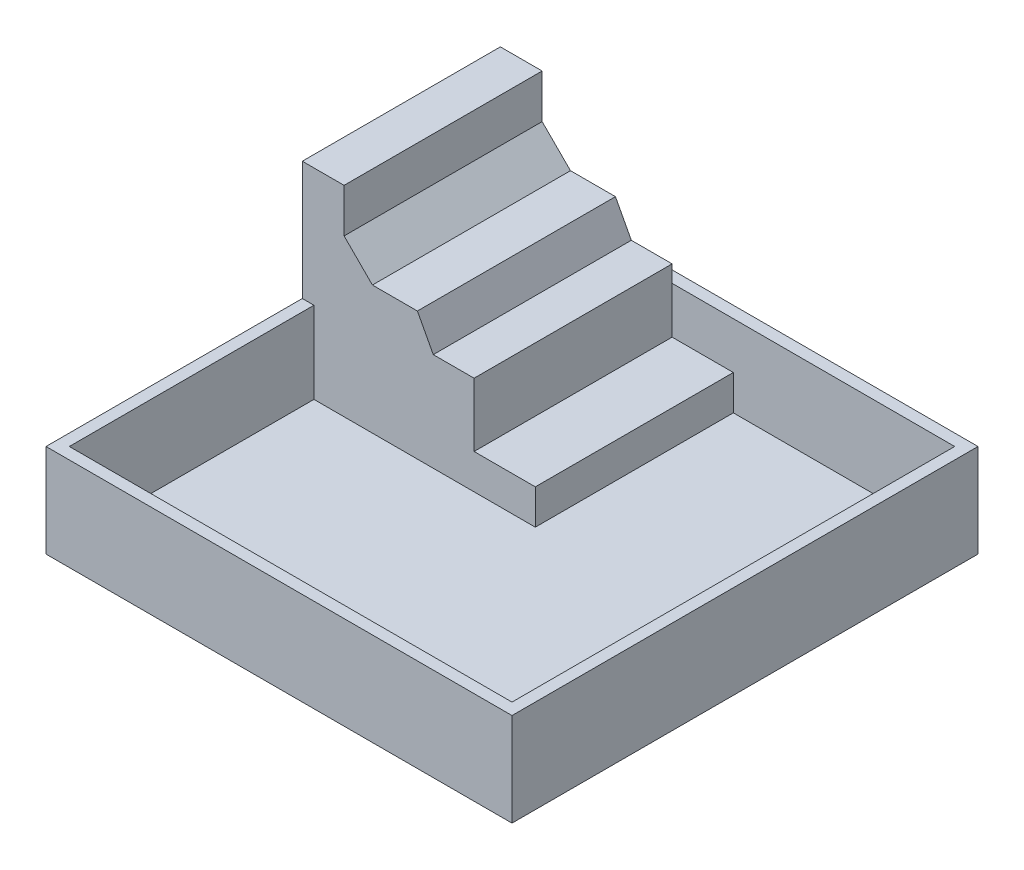
ISO-10303-21;
HEADER;
FILE_DESCRIPTION(('STEP AP214'),'2;1');
FILE_NAME('part.step','',(''),(''),'','','');
FILE_SCHEMA(('AUTOMOTIVE_DESIGN { 1 0 10303 214 1 1 1 1 }'));
ENDSEC;
DATA;
#1=APPLICATION_CONTEXT('core data for automotive mechanical design processes');
#2=APPLICATION_PROTOCOL_DEFINITION('international standard','automotive_design',2000,#1);
#3=PRODUCT_CONTEXT('',#1,'mechanical');
#4=PRODUCT('Part','Part','',(#3));
#5=PRODUCT_RELATED_PRODUCT_CATEGORY('part','',(#4));
#6=PRODUCT_DEFINITION_FORMATION('','',#4);
#7=PRODUCT_DEFINITION_CONTEXT('part definition',#1,'design');
#8=PRODUCT_DEFINITION('design','',#6,#7);
#9=PRODUCT_DEFINITION_SHAPE('','',#8);
#10=(LENGTH_UNIT() NAMED_UNIT(*) SI_UNIT(.MILLI.,.METRE.));
#11=(NAMED_UNIT(*) PLANE_ANGLE_UNIT() SI_UNIT($,.RADIAN.));
#12=(NAMED_UNIT(*) SI_UNIT($,.STERADIAN.) SOLID_ANGLE_UNIT());
#13=UNCERTAINTY_MEASURE_WITH_UNIT(LENGTH_MEASURE(1.E-05),#10,'distance_accuracy_value','');
#14=(GEOMETRIC_REPRESENTATION_CONTEXT(3) GLOBAL_UNCERTAINTY_ASSIGNED_CONTEXT((#13)) GLOBAL_UNIT_ASSIGNED_CONTEXT((#10,
#11,#12)) REPRESENTATION_CONTEXT('',''));
#15=CARTESIAN_POINT('',(0.,0.,0.));
#16=DIRECTION('',(0.,0.,1.));
#17=DIRECTION('',(1.,0.,0.));
#18=AXIS2_PLACEMENT_3D('',#15,#16,#17);
#19=CARTESIAN_POINT('',(0.,91.03608723386,-110.));
#20=DIRECTION('',(0.,-1.,0.));
#21=DIRECTION('',(0.,0.,-1.));
#22=AXIS2_PLACEMENT_3D('',#19,#20,#21);
#23=PLANE('',#22);
#24=DIRECTION('',(-1.,0.,0.));
#25=VECTOR('',#24,1.);
#26=CARTESIAN_POINT('',(0.,91.03608723386,-195.));
#27=LINE('',#26,#25);
#28=CARTESIAN_POINT('',(17.9354791316587,91.03608723386,-195.));
#29=VERTEX_POINT('',#28);
#30=CARTESIAN_POINT('',(0.,91.03608723386,-195.));
#31=VERTEX_POINT('',#30);
#32=EDGE_CURVE('E327',#29,#31,#27,.T.);
#33=ORIENTED_EDGE('',*,*,#32,.T.);
#34=DIRECTION('',(0.,0.,-1.));
#35=VECTOR('',#34,1.);
#36=CARTESIAN_POINT('',(0.,91.03608723386,-110.));
#37=LINE('',#36,#35);
#38=CARTESIAN_POINT('',(0.,91.03608723386,-110.));
#39=VERTEX_POINT('',#38);
#40=EDGE_CURVE('E213',#39,#31,#37,.T.);
#41=ORIENTED_EDGE('',*,*,#40,.F.);
#42=DIRECTION('',(-1.,0.,0.));
#43=VECTOR('',#42,1.);
#44=CARTESIAN_POINT('',(0.,91.03608723386,-110.));
#45=LINE('',#44,#43);
#46=CARTESIAN_POINT('',(17.9354791316587,91.03608723386,-110.));
#47=VERTEX_POINT('',#46);
#48=EDGE_CURVE('E208',#47,#39,#45,.T.);
#49=ORIENTED_EDGE('',*,*,#48,.F.);
#50=DIRECTION('',(0.,0.,-1.));
#51=VECTOR('',#50,1.);
#52=CARTESIAN_POINT('',(17.9354791316587,91.03608723386,-110.));
#53=LINE('',#52,#51);
#54=EDGE_CURVE('E11',#47,#29,#53,.T.);
#55=ORIENTED_EDGE('',*,*,#54,.T.);
#56=EDGE_LOOP('',(#33,#41,#49,#55));
#57=FACE_BOUND('',#56,.T.);
#58=ADVANCED_FACE('F17',(#57),#23,.F.);
#59=CARTESIAN_POINT('',(17.9354791316587,91.03608723386,-110.));
#60=DIRECTION('',(-1.,0.,0.));
#61=DIRECTION('',(0.,0.,1.));
#62=AXIS2_PLACEMENT_3D('',#59,#60,#61);
#63=PLANE('',#62);
#64=DIRECTION('',(0.,1.,0.));
#65=VECTOR('',#64,1.);
#66=CARTESIAN_POINT('',(17.9354791316587,91.03608723386,-195.));
#67=LINE('',#66,#65);
#68=CARTESIAN_POINT('',(17.9354791316587,72.2228769162165,-195.));
#69=VERTEX_POINT('',#68);
#70=EDGE_CURVE('E272',#69,#29,#67,.T.);
#71=ORIENTED_EDGE('',*,*,#70,.T.);
#72=ORIENTED_EDGE('',*,*,#54,.F.);
#73=DIRECTION('',(0.,1.,0.));
#74=VECTOR('',#73,1.);
#75=CARTESIAN_POINT('',(17.9354791316587,91.03608723386,-110.));
#76=LINE('',#75,#74);
#77=CARTESIAN_POINT('',(17.9354791316587,72.2228769162165,-110.));
#78=VERTEX_POINT('',#77);
#79=EDGE_CURVE('E328',#78,#47,#76,.T.);
#80=ORIENTED_EDGE('',*,*,#79,.F.);
#81=DIRECTION('',(0.,0.,-1.));
#82=VECTOR('',#81,1.);
#83=CARTESIAN_POINT('',(17.9354791316587,72.2228769162165,-110.));
#84=LINE('',#83,#82);
#85=EDGE_CURVE('E20',#78,#69,#84,.T.);
#86=ORIENTED_EDGE('',*,*,#85,.T.);
#87=EDGE_LOOP('',(#71,#72,#80,#86));
#88=FACE_BOUND('',#87,.T.);
#89=ADVANCED_FACE('F454',(#88),#63,.F.);
#90=CARTESIAN_POINT('',(17.9354791316587,72.2228769162165,-110.));
#91=DIRECTION('',(-0.707106781186536,-0.707106781186559,0.));
#92=DIRECTION('',(-0.707106781186559,0.707106781186536,0.));
#93=AXIS2_PLACEMENT_3D('',#90,#91,#92);
#94=PLANE('',#93);
#95=DIRECTION('',(-0.707106781186559,0.707106781186536,0.));
#96=VECTOR('',#95,1.);
#97=CARTESIAN_POINT('',(17.9354791316587,72.2228769162165,-195.));
#98=LINE('',#97,#96);
#99=CARTESIAN_POINT('',(30.0991926991008,60.0591633487748,-195.));
#100=VERTEX_POINT('',#99);
#101=EDGE_CURVE('E267',#100,#69,#98,.T.);
#102=ORIENTED_EDGE('',*,*,#101,.T.);
#103=ORIENTED_EDGE('',*,*,#85,.F.);
#104=DIRECTION('',(-0.707106781186559,0.707106781186536,0.));
#105=VECTOR('',#104,1.);
#106=CARTESIAN_POINT('',(17.9354791316587,72.2228769162165,-110.));
#107=LINE('',#106,#105);
#108=CARTESIAN_POINT('',(30.0991926991008,60.0591633487748,-110.));
#109=VERTEX_POINT('',#108);
#110=EDGE_CURVE('E388',#109,#78,#107,.T.);
#111=ORIENTED_EDGE('',*,*,#110,.F.);
#112=DIRECTION('',(0.,0.,-1.));
#113=VECTOR('',#112,1.);
#114=CARTESIAN_POINT('',(30.0991926991008,60.0591633487748,-110.));
#115=LINE('',#114,#113);
#116=EDGE_CURVE('E241',#109,#100,#115,.T.);
#117=ORIENTED_EDGE('',*,*,#116,.T.);
#118=EDGE_LOOP('',(#102,#103,#111,#117));
#119=FACE_BOUND('',#118,.T.);
#120=ADVANCED_FACE('F431',(#119),#94,.F.);
#121=CARTESIAN_POINT('',(30.0991926991008,60.0591633487748,-110.));
#122=DIRECTION('',(0.,-1.,0.));
#123=DIRECTION('',(0.,0.,-1.));
#124=AXIS2_PLACEMENT_3D('',#121,#122,#123);
#125=PLANE('',#124);
#126=DIRECTION('',(-1.,0.,0.));
#127=VECTOR('',#126,1.);
#128=CARTESIAN_POINT('',(30.0991926991008,60.0591633487748,-195.));
#129=LINE('',#128,#127);
#130=CARTESIAN_POINT('',(49.3989515594417,60.0591633487748,-195.));
#131=VERTEX_POINT('',#130);
#132=EDGE_CURVE('E271',#131,#100,#129,.T.);
#133=ORIENTED_EDGE('',*,*,#132,.T.);
#134=ORIENTED_EDGE('',*,*,#116,.F.);
#135=DIRECTION('',(-1.,0.,0.));
#136=VECTOR('',#135,1.);
#137=CARTESIAN_POINT('',(30.0991926991008,60.0591633487748,-110.));
#138=LINE('',#137,#136);
#139=CARTESIAN_POINT('',(49.3989515594417,60.0591633487748,-110.));
#140=VERTEX_POINT('',#139);
#141=EDGE_CURVE('E384',#140,#109,#138,.T.);
#142=ORIENTED_EDGE('',*,*,#141,.F.);
#143=DIRECTION('',(0.,0.,-1.));
#144=VECTOR('',#143,1.);
#145=CARTESIAN_POINT('',(49.3989515594417,60.0591633487748,-110.));
#146=LINE('',#145,#144);
#147=EDGE_CURVE('E243',#140,#131,#146,.T.);
#148=ORIENTED_EDGE('',*,*,#147,.T.);
#149=EDGE_LOOP('',(#133,#134,#142,#148));
#150=FACE_BOUND('',#149,.T.);
#151=ADVANCED_FACE('F419',(#150),#125,.F.);
#152=CARTESIAN_POINT('',(49.3989515594417,60.0591633487748,-110.));
#153=DIRECTION('',(-0.88297096578596,-0.469427602063416,0.));
#154=DIRECTION('',(-0.469427602063416,0.88297096578596,0.));
#155=AXIS2_PLACEMENT_3D('',#152,#153,#154);
#156=PLANE('',#155);
#157=DIRECTION('',(-0.469427602063416,0.88297096578596,0.));
#158=VECTOR('',#157,1.);
#159=CARTESIAN_POINT('',(49.3989515594417,60.0591633487748,-195.));
#160=LINE('',#159,#158);
#161=CARTESIAN_POINT('',(56.2106311572092,47.2467183910692,-195.));
#162=VERTEX_POINT('',#161);
#163=EDGE_CURVE('E402',#162,#131,#160,.T.);
#164=ORIENTED_EDGE('',*,*,#163,.T.);
#165=ORIENTED_EDGE('',*,*,#147,.F.);
#166=DIRECTION('',(-0.469427602063416,0.88297096578596,0.));
#167=VECTOR('',#166,1.);
#168=CARTESIAN_POINT('',(49.3989515594417,60.0591633487748,-110.));
#169=LINE('',#168,#167);
#170=CARTESIAN_POINT('',(56.2106311572092,47.2467183910692,-110.));
#171=VERTEX_POINT('',#170);
#172=EDGE_CURVE('E293',#171,#140,#169,.T.);
#173=ORIENTED_EDGE('',*,*,#172,.F.);
#174=DIRECTION('',(0.,0.,-1.));
#175=VECTOR('',#174,1.);
#176=CARTESIAN_POINT('',(56.2106311572092,47.2467183910692,-110.));
#177=LINE('',#176,#175);
#178=EDGE_CURVE('E50',#171,#162,#177,.T.);
#179=ORIENTED_EDGE('',*,*,#178,.T.);
#180=EDGE_LOOP('',(#164,#165,#173,#179));
#181=FACE_BOUND('',#180,.T.);
#182=ADVANCED_FACE('F423',(#181),#156,.F.);
#183=CARTESIAN_POINT('',(56.2106311572092,47.2467183910692,-110.));
#184=DIRECTION('',(0.,-1.,0.));
#185=DIRECTION('',(0.,0.,-1.));
#186=AXIS2_PLACEMENT_3D('',#183,#184,#185);
#187=PLANE('',#186);
#188=DIRECTION('',(-1.,0.,0.));
#189=VECTOR('',#188,1.);
#190=CARTESIAN_POINT('',(56.2106311572092,47.2467183910692,-195.));
#191=LINE('',#190,#189);
#192=CARTESIAN_POINT('',(73.7263786943255,47.2467183910692,-195.));
#193=VERTEX_POINT('',#192);
#194=EDGE_CURVE('E374',#193,#162,#191,.T.);
#195=ORIENTED_EDGE('',*,*,#194,.T.);
#196=ORIENTED_EDGE('',*,*,#178,.F.);
#197=DIRECTION('',(-1.,0.,0.));
#198=VECTOR('',#197,1.);
#199=CARTESIAN_POINT('',(56.2106311572092,47.2467183910692,-110.));
#200=LINE('',#199,#198);
#201=CARTESIAN_POINT('',(73.7263786943255,47.2467183910692,-110.));
#202=VERTEX_POINT('',#201);
#203=EDGE_CURVE('E289',#202,#171,#200,.T.);
#204=ORIENTED_EDGE('',*,*,#203,.F.);
#205=DIRECTION('',(0.,0.,-1.));
#206=VECTOR('',#205,1.);
#207=CARTESIAN_POINT('',(73.7263786943255,47.2467183910692,-110.));
#208=LINE('',#207,#206);
#209=EDGE_CURVE('E39',#202,#193,#208,.T.);
#210=ORIENTED_EDGE('',*,*,#209,.T.);
#211=EDGE_LOOP('',(#195,#196,#204,#210));
#212=FACE_BOUND('',#211,.T.);
#213=ADVANCED_FACE('F435',(#212),#187,.F.);
#214=CARTESIAN_POINT('',(73.7263786943255,47.2467183910692,-110.));
#215=DIRECTION('',(-1.,0.,0.));
#216=DIRECTION('',(0.,0.,1.));
#217=AXIS2_PLACEMENT_3D('',#214,#215,#216);
#218=PLANE('',#217);
#219=DIRECTION('',(0.,1.,0.));
#220=VECTOR('',#219,1.);
#221=CARTESIAN_POINT('',(73.7263786943255,47.2467183910692,-195.));
#222=LINE('',#221,#220);
#223=CARTESIAN_POINT('',(73.7263786943255,19.9999999999993,-195.));
#224=VERTEX_POINT('',#223);
#225=CARTESIAN_POINT('',(73.7263786943255,40.,-195.));
#226=VERTEX_POINT('',#225);
#227=EDGE_CURVE('E320',#224,#226,#222,.T.);
#228=ORIENTED_EDGE('',*,*,#227,.T.);
#229=DIRECTION('',(0.,1.,0.));
#230=VECTOR('',#229,1.);
#231=CARTESIAN_POINT('',(73.7263786943255,47.2467183910692,-195.));
#232=LINE('',#231,#230);
#233=EDGE_CURVE('E370',#226,#193,#232,.T.);
#234=ORIENTED_EDGE('',*,*,#233,.T.);
#235=ORIENTED_EDGE('',*,*,#209,.F.);
#236=DIRECTION('',(0.,1.,0.));
#237=VECTOR('',#236,1.);
#238=CARTESIAN_POINT('',(73.7263786943255,47.2467183910692,-110.));
#239=LINE('',#238,#237);
#240=CARTESIAN_POINT('',(73.7263786943255,19.9999999999993,-110.));
#241=VERTEX_POINT('',#240);
#242=EDGE_CURVE('E294',#241,#202,#239,.T.);
#243=ORIENTED_EDGE('',*,*,#242,.F.);
#244=DIRECTION('',(0.,0.,-1.));
#245=VECTOR('',#244,1.);
#246=CARTESIAN_POINT('',(73.7263786943255,19.9999999999993,-110.));
#247=LINE('',#246,#245);
#248=EDGE_CURVE('E409',#241,#224,#247,.T.);
#249=ORIENTED_EDGE('',*,*,#248,.T.);
#250=EDGE_LOOP('',(#228,#234,#235,#243,#249));
#251=FACE_BOUND('',#250,.T.);
#252=ADVANCED_FACE('F439',(#251),#218,.F.);
#253=CARTESIAN_POINT('',(73.7263786943255,19.9999999999993,-110.));
#254=DIRECTION('',(0.,-1.,0.));
#255=DIRECTION('',(0.,0.,-1.));
#256=AXIS2_PLACEMENT_3D('',#253,#254,#255);
#257=PLANE('',#256);
#258=DIRECTION('',(-1.,0.,0.));
#259=VECTOR('',#258,1.);
#260=CARTESIAN_POINT('',(73.7263786943255,19.9999999999993,-195.));
#261=LINE('',#260,#259);
#262=CARTESIAN_POINT('',(100.,19.9999999999993,-195.));
#263=VERTEX_POINT('',#262);
#264=EDGE_CURVE('E324',#263,#224,#261,.T.);
#265=ORIENTED_EDGE('',*,*,#264,.T.);
#266=ORIENTED_EDGE('',*,*,#248,.F.);
#267=DIRECTION('',(-1.,0.,0.));
#268=VECTOR('',#267,1.);
#269=CARTESIAN_POINT('',(73.7263786943255,19.9999999999993,-110.));
#270=LINE('',#269,#268);
#271=CARTESIAN_POINT('',(100.,19.9999999999993,-110.));
#272=VERTEX_POINT('',#271);
#273=EDGE_CURVE('E303',#272,#241,#270,.T.);
#274=ORIENTED_EDGE('',*,*,#273,.F.);
#275=DIRECTION('',(0.,0.,-1.));
#276=VECTOR('',#275,1.);
#277=CARTESIAN_POINT('',(100.,19.9999999999993,-110.));
#278=LINE('',#277,#276);
#279=EDGE_CURVE('E373',#272,#263,#278,.T.);
#280=ORIENTED_EDGE('',*,*,#279,.T.);
#281=EDGE_LOOP('',(#265,#266,#274,#280));
#282=FACE_BOUND('',#281,.T.);
#283=ADVANCED_FACE('F528',(#282),#257,.F.);
#284=CARTESIAN_POINT('',(100.,19.9999999999993,-110.));
#285=DIRECTION('',(-1.,0.,0.));
#286=DIRECTION('',(0.,0.,1.));
#287=AXIS2_PLACEMENT_3D('',#284,#285,#286);
#288=PLANE('',#287);
#289=DIRECTION('',(0.,0.,1.));
#290=VECTOR('',#289,1.);
#291=CARTESIAN_POINT('',(100.,5.,0.));
#292=LINE('',#291,#290);
#293=CARTESIAN_POINT('',(100.,5.,-195.));
#294=VERTEX_POINT('',#293);
#295=CARTESIAN_POINT('',(100.,5.,-110.));
#296=VERTEX_POINT('',#295);
#297=EDGE_CURVE('E332',#294,#296,#292,.T.);
#298=ORIENTED_EDGE('',*,*,#297,.F.);
#299=DIRECTION('',(0.,1.,0.));
#300=VECTOR('',#299,1.);
#301=CARTESIAN_POINT('',(100.,19.9999999999993,-195.));
#302=LINE('',#301,#300);
#303=EDGE_CURVE('E261',#294,#263,#302,.T.);
#304=ORIENTED_EDGE('',*,*,#303,.T.);
#305=ORIENTED_EDGE('',*,*,#279,.F.);
#306=DIRECTION('',(0.,1.,0.));
#307=VECTOR('',#306,1.);
#308=CARTESIAN_POINT('',(100.,19.9999999999993,-110.));
#309=LINE('',#308,#307);
#310=EDGE_CURVE('E299',#296,#272,#309,.T.);
#311=ORIENTED_EDGE('',*,*,#310,.F.);
#312=EDGE_LOOP('',(#298,#304,#305,#311));
#313=FACE_BOUND('',#312,.T.);
#314=ADVANCED_FACE('F524',(#313),#288,.F.);
#315=CARTESIAN_POINT('',(0.,0.,-195.));
#316=DIRECTION('',(0.,0.,-1.));
#317=DIRECTION('',(0.,-1.,0.));
#318=AXIS2_PLACEMENT_3D('',#315,#316,#317);
#319=PLANE('',#318);
#320=DIRECTION('',(1.,0.,0.));
#321=VECTOR('',#320,1.);
#322=CARTESIAN_POINT('',(0.,40.,-195.));
#323=LINE('',#322,#321);
#324=CARTESIAN_POINT('',(0.,40.,-195.));
#325=VERTEX_POINT('',#324);
#326=EDGE_CURVE('E276',#325,#226,#323,.T.);
#327=ORIENTED_EDGE('',*,*,#326,.F.);
#328=DIRECTION('',(0.,-1.,0.));
#329=VECTOR('',#328,1.);
#330=CARTESIAN_POINT('',(0.,40.,-195.));
#331=LINE('',#330,#329);
#332=EDGE_CURVE('E350',#31,#325,#331,.T.);
#333=ORIENTED_EDGE('',*,*,#332,.F.);
#334=ORIENTED_EDGE('',*,*,#32,.F.);
#335=ORIENTED_EDGE('',*,*,#70,.F.);
#336=ORIENTED_EDGE('',*,*,#101,.F.);
#337=ORIENTED_EDGE('',*,*,#132,.F.);
#338=ORIENTED_EDGE('',*,*,#163,.F.);
#339=ORIENTED_EDGE('',*,*,#194,.F.);
#340=ORIENTED_EDGE('',*,*,#233,.F.);
#341=EDGE_LOOP('',(#327,#333,#334,#335,#336,#337,#338,#339,#340));
#342=FACE_BOUND('',#341,.T.);
#343=ADVANCED_FACE('F427',(#342),#319,.T.);
#344=CARTESIAN_POINT('',(0.,0.,-110.));
#345=DIRECTION('',(0.,0.,-1.));
#346=DIRECTION('',(0.,-1.,0.));
#347=AXIS2_PLACEMENT_3D('',#344,#345,#346);
#348=PLANE('',#347);
#349=DIRECTION('',(0.,-1.,0.));
#350=VECTOR('',#349,1.);
#351=CARTESIAN_POINT('',(0.,0.,-110.));
#352=LINE('',#351,#350);
#353=CARTESIAN_POINT('',(0.,40.,-110.));
#354=VERTEX_POINT('',#353);
#355=EDGE_CURVE('E200',#39,#354,#352,.T.);
#356=ORIENTED_EDGE('',*,*,#355,.T.);
#357=DIRECTION('',(1.,0.,0.));
#358=VECTOR('',#357,1.);
#359=CARTESIAN_POINT('',(0.,40.,-110.));
#360=LINE('',#359,#358);
#361=CARTESIAN_POINT('',(5.,40.,-110.));
#362=VERTEX_POINT('',#361);
#363=EDGE_CURVE('E205',#354,#362,#360,.T.);
#364=ORIENTED_EDGE('',*,*,#363,.T.);
#365=DIRECTION('',(0.,-1.,0.));
#366=VECTOR('',#365,1.);
#367=CARTESIAN_POINT('',(5.,5.,-110.));
#368=LINE('',#367,#366);
#369=CARTESIAN_POINT('',(5.,5.,-110.));
#370=VERTEX_POINT('',#369);
#371=EDGE_CURVE('E287',#362,#370,#368,.T.);
#372=ORIENTED_EDGE('',*,*,#371,.T.);
#373=DIRECTION('',(-1.,0.,0.));
#374=VECTOR('',#373,1.);
#375=CARTESIAN_POINT('',(0.,5.,-110.));
#376=LINE('',#375,#374);
#377=EDGE_CURVE('E336',#296,#370,#376,.T.);
#378=ORIENTED_EDGE('',*,*,#377,.F.);
#379=ORIENTED_EDGE('',*,*,#310,.T.);
#380=ORIENTED_EDGE('',*,*,#273,.T.);
#381=ORIENTED_EDGE('',*,*,#242,.T.);
#382=ORIENTED_EDGE('',*,*,#203,.T.);
#383=ORIENTED_EDGE('',*,*,#172,.T.);
#384=ORIENTED_EDGE('',*,*,#141,.T.);
#385=ORIENTED_EDGE('',*,*,#110,.T.);
#386=ORIENTED_EDGE('',*,*,#79,.T.);
#387=ORIENTED_EDGE('',*,*,#48,.T.);
#388=EDGE_LOOP('',(#356,#364,#372,#378,#379,#380,#381,#382,#383,#384,#385,#386,#387));
#389=FACE_BOUND('',#388,.T.);
#390=ADVANCED_FACE('F202',(#389),#348,.F.);
#391=CARTESIAN_POINT('',(5.,5.,-5.));
#392=DIRECTION('',(0.,0.,1.));
#393=DIRECTION('',(1.,0.,0.));
#394=AXIS2_PLACEMENT_3D('',#391,#392,#393);
#395=PLANE('',#394);
#396=DIRECTION('',(1.,0.,0.));
#397=VECTOR('',#396,1.);
#398=CARTESIAN_POINT('',(5.,40.,-5.));
#399=LINE('',#398,#397);
#400=CARTESIAN_POINT('',(5.,40.,-5.));
#401=VERTEX_POINT('',#400);
#402=CARTESIAN_POINT('',(195.,40.,-5.));
#403=VERTEX_POINT('',#402);
#404=EDGE_CURVE('E288',#401,#403,#399,.T.);
#405=ORIENTED_EDGE('',*,*,#404,.T.);
#406=DIRECTION('',(0.,1.,0.));
#407=VECTOR('',#406,1.);
#408=CARTESIAN_POINT('',(195.,5.,-5.));
#409=LINE('',#408,#407);
#410=CARTESIAN_POINT('',(195.,5.,-5.));
#411=VERTEX_POINT('',#410);
#412=EDGE_CURVE('E304',#411,#403,#409,.T.);
#413=ORIENTED_EDGE('',*,*,#412,.F.);
#414=DIRECTION('',(1.,0.,0.));
#415=VECTOR('',#414,1.);
#416=CARTESIAN_POINT('',(5.,5.,-5.));
#417=LINE('',#416,#415);
#418=CARTESIAN_POINT('',(5.,5.,-5.));
#419=VERTEX_POINT('',#418);
#420=EDGE_CURVE('E339',#419,#411,#417,.T.);
#421=ORIENTED_EDGE('',*,*,#420,.F.);
#422=DIRECTION('',(0.,1.,0.));
#423=VECTOR('',#422,1.);
#424=CARTESIAN_POINT('',(5.,5.,-5.));
#425=LINE('',#424,#423);
#426=EDGE_CURVE('E262',#419,#401,#425,.T.);
#427=ORIENTED_EDGE('',*,*,#426,.T.);
#428=EDGE_LOOP('',(#405,#413,#421,#427));
#429=FACE_BOUND('',#428,.T.);
#430=ADVANCED_FACE('F546',(#429),#395,.F.);
#431=CARTESIAN_POINT('',(195.,5.,-195.));
#432=DIRECTION('',(1.,0.,0.));
#433=DIRECTION('',(0.,0.,-1.));
#434=AXIS2_PLACEMENT_3D('',#431,#432,#433);
#435=PLANE('',#434);
#436=DIRECTION('',(0.,0.,-1.));
#437=VECTOR('',#436,1.);
#438=CARTESIAN_POINT('',(195.,40.,-195.));
#439=LINE('',#438,#437);
#440=CARTESIAN_POINT('',(195.,40.,-195.));
#441=VERTEX_POINT('',#440);
#442=EDGE_CURVE('E284',#403,#441,#439,.T.);
#443=ORIENTED_EDGE('',*,*,#442,.T.);
#444=DIRECTION('',(0.,1.,0.));
#445=VECTOR('',#444,1.);
#446=CARTESIAN_POINT('',(195.,5.,-195.));
#447=LINE('',#446,#445);
#448=CARTESIAN_POINT('',(195.,5.,-195.));
#449=VERTEX_POINT('',#448);
#450=EDGE_CURVE('E314',#449,#441,#447,.T.);
#451=ORIENTED_EDGE('',*,*,#450,.F.);
#452=DIRECTION('',(0.,0.,-1.));
#453=VECTOR('',#452,1.);
#454=CARTESIAN_POINT('',(195.,5.,-195.));
#455=LINE('',#454,#453);
#456=EDGE_CURVE('E343',#411,#449,#455,.T.);
#457=ORIENTED_EDGE('',*,*,#456,.F.);
#458=ORIENTED_EDGE('',*,*,#412,.T.);
#459=EDGE_LOOP('',(#443,#451,#457,#458));
#460=FACE_BOUND('',#459,.T.);
#461=ADVANCED_FACE('F509',(#460),#435,.F.);
#462=CARTESIAN_POINT('',(0.,0.,0.));
#463=DIRECTION('',(0.,-1.,0.));
#464=DIRECTION('',(0.,0.,-1.));
#465=AXIS2_PLACEMENT_3D('',#462,#463,#464);
#466=PLANE('',#465);
#467=DIRECTION('',(1.,0.,0.));
#468=VECTOR('',#467,1.);
#469=CARTESIAN_POINT('',(0.,0.,0.));
#470=LINE('',#469,#468);
#471=CARTESIAN_POINT('',(0.,0.,0.));
#472=VERTEX_POINT('',#471);
#473=CARTESIAN_POINT('',(200.,0.,0.));
#474=VERTEX_POINT('',#473);
#475=EDGE_CURVE('E357',#472,#474,#470,.T.);
#476=ORIENTED_EDGE('',*,*,#475,.F.);
#477=DIRECTION('',(0.,0.,1.));
#478=VECTOR('',#477,1.);
#479=CARTESIAN_POINT('',(0.,0.,0.));
#480=LINE('',#479,#478);
#481=CARTESIAN_POINT('',(0.,0.,-200.));
#482=VERTEX_POINT('',#481);
#483=EDGE_CURVE('E317',#482,#472,#480,.T.);
#484=ORIENTED_EDGE('',*,*,#483,.F.);
#485=DIRECTION('',(-1.,0.,0.));
#486=VECTOR('',#485,1.);
#487=CARTESIAN_POINT('',(0.,0.,-200.));
#488=LINE('',#487,#486);
#489=CARTESIAN_POINT('',(200.,0.,-200.));
#490=VERTEX_POINT('',#489);
#491=EDGE_CURVE('E251',#490,#482,#488,.T.);
#492=ORIENTED_EDGE('',*,*,#491,.F.);
#493=DIRECTION('',(0.,0.,-1.));
#494=VECTOR('',#493,1.);
#495=CARTESIAN_POINT('',(200.,0.,0.));
#496=LINE('',#495,#494);
#497=EDGE_CURVE('E252',#474,#490,#496,.T.);
#498=ORIENTED_EDGE('',*,*,#497,.F.);
#499=EDGE_LOOP('',(#476,#484,#492,#498));
#500=FACE_BOUND('',#499,.T.);
#501=ADVANCED_FACE('F504',(#500),#466,.T.);
#502=CARTESIAN_POINT('',(0.,40.,-200.));
#503=DIRECTION('',(0.,0.,1.));
#504=DIRECTION('',(1.,0.,0.));
#505=AXIS2_PLACEMENT_3D('',#502,#503,#504);
#506=PLANE('',#505);
#507=ORIENTED_EDGE('',*,*,#491,.T.);
#508=DIRECTION('',(0.,-1.,0.));
#509=VECTOR('',#508,1.);
#510=CARTESIAN_POINT('',(0.,40.,-200.));
#511=LINE('',#510,#509);
#512=CARTESIAN_POINT('',(0.,40.,-200.));
#513=VERTEX_POINT('',#512);
#514=EDGE_CURVE('E353',#513,#482,#511,.T.);
#515=ORIENTED_EDGE('',*,*,#514,.F.);
#516=DIRECTION('',(-1.,0.,0.));
#517=VECTOR('',#516,1.);
#518=CARTESIAN_POINT('',(0.,40.,-200.));
#519=LINE('',#518,#517);
#520=CARTESIAN_POINT('',(200.,40.,-200.));
#521=VERTEX_POINT('',#520);
#522=EDGE_CURVE('E256',#521,#513,#519,.T.);
#523=ORIENTED_EDGE('',*,*,#522,.F.);
#524=DIRECTION('',(0.,-1.,0.));
#525=VECTOR('',#524,1.);
#526=CARTESIAN_POINT('',(200.,40.,-200.));
#527=LINE('',#526,#525);
#528=EDGE_CURVE('E247',#521,#490,#527,.T.);
#529=ORIENTED_EDGE('',*,*,#528,.T.);
#530=EDGE_LOOP('',(#507,#515,#523,#529));
#531=FACE_BOUND('',#530,.T.);
#532=ADVANCED_FACE('F508',(#531),#506,.F.);
#533=CARTESIAN_POINT('',(200.,40.,0.));
#534=DIRECTION('',(-1.,0.,0.));
#535=DIRECTION('',(0.,0.,1.));
#536=AXIS2_PLACEMENT_3D('',#533,#534,#535);
#537=PLANE('',#536);
#538=ORIENTED_EDGE('',*,*,#497,.T.);
#539=ORIENTED_EDGE('',*,*,#528,.F.);
#540=DIRECTION('',(0.,0.,-1.));
#541=VECTOR('',#540,1.);
#542=CARTESIAN_POINT('',(200.,40.,0.));
#543=LINE('',#542,#541);
#544=CARTESIAN_POINT('',(200.,40.,0.));
#545=VERTEX_POINT('',#544);
#546=EDGE_CURVE('E245',#545,#521,#543,.T.);
#547=ORIENTED_EDGE('',*,*,#546,.F.);
#548=DIRECTION('',(0.,-1.,0.));
#549=VECTOR('',#548,1.);
#550=CARTESIAN_POINT('',(200.,40.,0.));
#551=LINE('',#550,#549);
#552=EDGE_CURVE('E361',#545,#474,#551,.T.);
#553=ORIENTED_EDGE('',*,*,#552,.T.);
#554=EDGE_LOOP('',(#538,#539,#547,#553));
#555=FACE_BOUND('',#554,.T.);
#556=ADVANCED_FACE('F468',(#555),#537,.F.);
#557=CARTESIAN_POINT('',(0.,40.,0.));
#558=DIRECTION('',(0.,0.,-1.));
#559=DIRECTION('',(0.,-1.,0.));
#560=AXIS2_PLACEMENT_3D('',#557,#558,#559);
#561=PLANE('',#560);
#562=ORIENTED_EDGE('',*,*,#475,.T.);
#563=ORIENTED_EDGE('',*,*,#552,.F.);
#564=DIRECTION('',(1.,0.,0.));
#565=VECTOR('',#564,1.);
#566=CARTESIAN_POINT('',(0.,40.,0.));
#567=LINE('',#566,#565);
#568=CARTESIAN_POINT('',(0.,40.,0.));
#569=VERTEX_POINT('',#568);
#570=EDGE_CURVE('E225',#569,#545,#567,.T.);
#571=ORIENTED_EDGE('',*,*,#570,.F.);
#572=DIRECTION('',(0.,-1.,0.));
#573=VECTOR('',#572,1.);
#574=CARTESIAN_POINT('',(0.,40.,0.));
#575=LINE('',#574,#573);
#576=EDGE_CURVE('E214',#569,#472,#575,.T.);
#577=ORIENTED_EDGE('',*,*,#576,.T.);
#578=EDGE_LOOP('',(#562,#563,#571,#577));
#579=FACE_BOUND('',#578,.T.);
#580=ADVANCED_FACE('F463',(#579),#561,.F.);
#581=CARTESIAN_POINT('',(0.,40.,0.));
#582=DIRECTION('',(1.,0.,0.));
#583=DIRECTION('',(0.,1.,0.));
#584=AXIS2_PLACEMENT_3D('',#581,#582,#583);
#585=PLANE('',#584);
#586=ORIENTED_EDGE('',*,*,#483,.T.);
#587=ORIENTED_EDGE('',*,*,#576,.F.);
#588=DIRECTION('',(0.,0.,1.));
#589=VECTOR('',#588,1.);
#590=CARTESIAN_POINT('',(0.,40.,0.));
#591=LINE('',#590,#589);
#592=EDGE_CURVE('E217',#354,#569,#591,.T.);
#593=ORIENTED_EDGE('',*,*,#592,.F.);
#594=ORIENTED_EDGE('',*,*,#355,.F.);
#595=ORIENTED_EDGE('',*,*,#40,.T.);
#596=ORIENTED_EDGE('',*,*,#332,.T.);
#597=DIRECTION('',(0.,0.,1.));
#598=VECTOR('',#597,1.);
#599=CARTESIAN_POINT('',(0.,40.,0.));
#600=LINE('',#599,#598);
#601=EDGE_CURVE('E266',#513,#325,#600,.T.);
#602=ORIENTED_EDGE('',*,*,#601,.F.);
#603=ORIENTED_EDGE('',*,*,#514,.T.);
#604=EDGE_LOOP('',(#586,#587,#593,#594,#595,#596,#602,#603));
#605=FACE_BOUND('',#604,.T.);
#606=ADVANCED_FACE('F219',(#605),#585,.F.);
#607=CARTESIAN_POINT('',(0.,5.,0.));
#608=DIRECTION('',(0.,1.,0.));
#609=DIRECTION('',(1.,0.,0.));
#610=AXIS2_PLACEMENT_3D('',#607,#608,#609);
#611=PLANE('',#610);
#612=DIRECTION('',(-1.,0.,0.));
#613=VECTOR('',#612,1.);
#614=CARTESIAN_POINT('',(5.,5.,-195.));
#615=LINE('',#614,#613);
#616=EDGE_CURVE('E308',#449,#294,#615,.T.);
#617=ORIENTED_EDGE('',*,*,#616,.T.);
#618=ORIENTED_EDGE('',*,*,#297,.T.);
#619=ORIENTED_EDGE('',*,*,#377,.T.);
#620=DIRECTION('',(0.,0.,1.));
#621=VECTOR('',#620,1.);
#622=CARTESIAN_POINT('',(5.,5.,-195.));
#623=LINE('',#622,#621);
#624=EDGE_CURVE('E257',#370,#419,#623,.T.);
#625=ORIENTED_EDGE('',*,*,#624,.T.);
#626=ORIENTED_EDGE('',*,*,#420,.T.);
#627=ORIENTED_EDGE('',*,*,#456,.T.);
#628=EDGE_LOOP('',(#617,#618,#619,#625,#626,#627));
#629=FACE_BOUND('',#628,.T.);
#630=ADVANCED_FACE('F476',(#629),#611,.T.);
#631=CARTESIAN_POINT('',(5.,5.,-195.));
#632=DIRECTION('',(0.,0.,-1.));
#633=DIRECTION('',(0.,-1.,0.));
#634=AXIS2_PLACEMENT_3D('',#631,#632,#633);
#635=PLANE('',#634);
#636=ORIENTED_EDGE('',*,*,#303,.F.);
#637=ORIENTED_EDGE('',*,*,#616,.F.);
#638=ORIENTED_EDGE('',*,*,#450,.T.);
#639=DIRECTION('',(-1.,0.,0.));
#640=VECTOR('',#639,1.);
#641=CARTESIAN_POINT('',(5.,40.,-195.));
#642=LINE('',#641,#640);
#643=EDGE_CURVE('E279',#441,#226,#642,.T.);
#644=ORIENTED_EDGE('',*,*,#643,.T.);
#645=ORIENTED_EDGE('',*,*,#227,.F.);
#646=ORIENTED_EDGE('',*,*,#264,.F.);
#647=EDGE_LOOP('',(#636,#637,#638,#644,#645,#646));
#648=FACE_BOUND('',#647,.T.);
#649=ADVANCED_FACE('F444',(#648),#635,.F.);
#650=CARTESIAN_POINT('',(5.,5.,-195.));
#651=DIRECTION('',(-1.,0.,0.));
#652=DIRECTION('',(0.,1.,0.));
#653=AXIS2_PLACEMENT_3D('',#650,#651,#652);
#654=PLANE('',#653);
#655=ORIENTED_EDGE('',*,*,#371,.F.);
#656=DIRECTION('',(0.,0.,1.));
#657=VECTOR('',#656,1.);
#658=CARTESIAN_POINT('',(5.,40.,-195.));
#659=LINE('',#658,#657);
#660=EDGE_CURVE('E231',#362,#401,#659,.T.);
#661=ORIENTED_EDGE('',*,*,#660,.T.);
#662=ORIENTED_EDGE('',*,*,#426,.F.);
#663=ORIENTED_EDGE('',*,*,#624,.F.);
#664=EDGE_LOOP('',(#655,#661,#662,#663));
#665=FACE_BOUND('',#664,.T.);
#666=ADVANCED_FACE('F489',(#665),#654,.F.);
#667=CARTESIAN_POINT('',(0.,40.,0.));
#668=DIRECTION('',(0.,-1.,0.));
#669=DIRECTION('',(0.,0.,-1.));
#670=AXIS2_PLACEMENT_3D('',#667,#668,#669);
#671=PLANE('',#670);
#672=ORIENTED_EDGE('',*,*,#363,.F.);
#673=ORIENTED_EDGE('',*,*,#592,.T.);
#674=ORIENTED_EDGE('',*,*,#570,.T.);
#675=ORIENTED_EDGE('',*,*,#546,.T.);
#676=ORIENTED_EDGE('',*,*,#522,.T.);
#677=ORIENTED_EDGE('',*,*,#601,.T.);
#678=ORIENTED_EDGE('',*,*,#326,.T.);
#679=ORIENTED_EDGE('',*,*,#643,.F.);
#680=ORIENTED_EDGE('',*,*,#442,.F.);
#681=ORIENTED_EDGE('',*,*,#404,.F.);
#682=ORIENTED_EDGE('',*,*,#660,.F.);
#683=EDGE_LOOP('',(#672,#673,#674,#675,#676,#677,#678,#679,#680,#681,#682));
#684=FACE_BOUND('',#683,.T.);
#685=ADVANCED_FACE('F228',(#684),#671,.F.);
#686=CLOSED_SHELL('',(#58,#89,#120,#151,#182,#213,#252,#283,#314,#343,#390,#430,#461,#501,#532,
#556,#580,#606,#630,#649,#666,#685));
#687=MANIFOLD_SOLID_BREP('B1',#686);
#688=ADVANCED_BREP_SHAPE_REPRESENTATION('',(#18,#687),#14);
#689=SHAPE_DEFINITION_REPRESENTATION(#9,#688);
ENDSEC;
END-ISO-10303-21;
